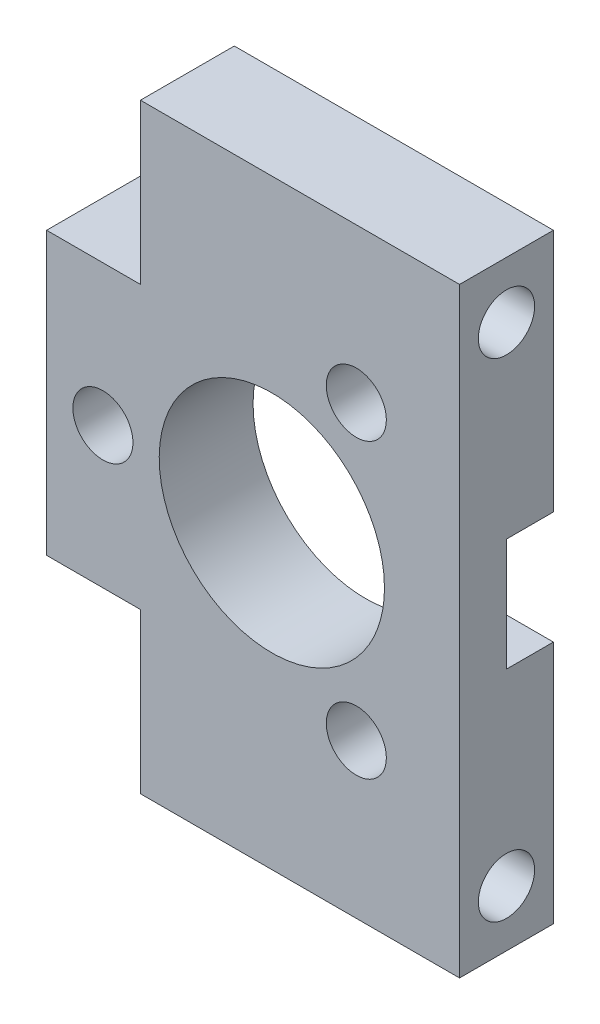
ISO-10303-21;
HEADER;
FILE_DESCRIPTION(('STEP AP214'),'2;1');
FILE_NAME('part.step','',(''),(''),'','','');
FILE_SCHEMA(('AUTOMOTIVE_DESIGN { 1 0 10303 214 1 1 1 1 }'));
ENDSEC;
DATA;
#1=APPLICATION_CONTEXT('core data for automotive mechanical design processes');
#2=APPLICATION_PROTOCOL_DEFINITION('international standard','automotive_design',2000,#1);
#3=PRODUCT_CONTEXT('',#1,'mechanical');
#4=PRODUCT('Part','Part','',(#3));
#5=PRODUCT_RELATED_PRODUCT_CATEGORY('part','',(#4));
#6=PRODUCT_DEFINITION_FORMATION('','',#4);
#7=PRODUCT_DEFINITION_CONTEXT('part definition',#1,'design');
#8=PRODUCT_DEFINITION('design','',#6,#7);
#9=PRODUCT_DEFINITION_SHAPE('','',#8);
#10=(LENGTH_UNIT() NAMED_UNIT(*) SI_UNIT(.MILLI.,.METRE.));
#11=(NAMED_UNIT(*) PLANE_ANGLE_UNIT() SI_UNIT($,.RADIAN.));
#12=(NAMED_UNIT(*) SI_UNIT($,.STERADIAN.) SOLID_ANGLE_UNIT());
#13=UNCERTAINTY_MEASURE_WITH_UNIT(LENGTH_MEASURE(1.E-05),#10,'distance_accuracy_value','');
#14=(GEOMETRIC_REPRESENTATION_CONTEXT(3) GLOBAL_UNCERTAINTY_ASSIGNED_CONTEXT((#13)) GLOBAL_UNIT_ASSIGNED_CONTEXT((#10,
#11,#12)) REPRESENTATION_CONTEXT('',''));
#15=CARTESIAN_POINT('',(0.,0.,0.));
#16=DIRECTION('',(0.,0.,1.));
#17=DIRECTION('',(1.,0.,0.));
#18=AXIS2_PLACEMENT_3D('',#15,#16,#17);
#19=CARTESIAN_POINT('',(-7.,7.5,5.));
#20=DIRECTION('',(0.,0.,-1.));
#21=DIRECTION('',(-1.,0.,0.));
#22=AXIS2_PLACEMENT_3D('',#19,#20,#21);
#23=PLANE('',#22);
#24=CARTESIAN_POINT('',(4.50000000000004,7.79422863405993,5.));
#25=DIRECTION('',(0.,0.,1.));
#26=DIRECTION('',(1.,0.,0.));
#27=AXIS2_PLACEMENT_3D('',#24,#25,#26);
#28=CIRCLE('',#27,1.59999999999937);
#29=CARTESIAN_POINT('',(6.09999999999941,7.79422863405993,5.));
#30=VERTEX_POINT('',#29);
#31=EDGE_CURVE('E232',#30,#30,#28,.T.);
#32=ORIENTED_EDGE('',*,*,#31,.F.);
#33=EDGE_LOOP('',(#32));
#34=FACE_BOUND('',#33,.T.);
#35=CARTESIAN_POINT('',(0.,0.,5.));
#36=DIRECTION('',(0.,0.,1.));
#37=DIRECTION('',(1.,0.,0.));
#38=AXIS2_PLACEMENT_3D('',#35,#36,#37);
#39=CIRCLE('',#38,6.);
#40=CARTESIAN_POINT('',(6.,0.,5.));
#41=VERTEX_POINT('',#40);
#42=EDGE_CURVE('E155',#41,#41,#39,.T.);
#43=ORIENTED_EDGE('',*,*,#42,.F.);
#44=EDGE_LOOP('',(#43));
#45=FACE_BOUND('',#44,.T.);
#46=DIRECTION('',(0.,-1.,0.));
#47=VECTOR('',#46,1.);
#48=CARTESIAN_POINT('',(-7.,16.,5.));
#49=LINE('',#48,#47);
#50=CARTESIAN_POINT('',(-7.,16.,5.));
#51=VERTEX_POINT('',#50);
#52=CARTESIAN_POINT('',(-7.,7.5,5.));
#53=VERTEX_POINT('',#52);
#54=EDGE_CURVE('E168',#51,#53,#49,.T.);
#55=ORIENTED_EDGE('',*,*,#54,.T.);
#56=DIRECTION('',(-1.,0.,0.));
#57=VECTOR('',#56,1.);
#58=CARTESIAN_POINT('',(-7.,7.5,5.));
#59=LINE('',#58,#57);
#60=CARTESIAN_POINT('',(-12.,7.5,5.));
#61=VERTEX_POINT('',#60);
#62=EDGE_CURVE('E106',#53,#61,#59,.T.);
#63=ORIENTED_EDGE('',*,*,#62,.T.);
#64=DIRECTION('',(0.,-1.,0.));
#65=VECTOR('',#64,1.);
#66=CARTESIAN_POINT('',(-12.,7.5,5.));
#67=LINE('',#66,#65);
#68=CARTESIAN_POINT('',(-12.,-7.5,5.));
#69=VERTEX_POINT('',#68);
#70=EDGE_CURVE('E249',#61,#69,#67,.T.);
#71=ORIENTED_EDGE('',*,*,#70,.T.);
#72=DIRECTION('',(1.,0.,0.));
#73=VECTOR('',#72,1.);
#74=CARTESIAN_POINT('',(-12.,-7.5,5.));
#75=LINE('',#74,#73);
#76=CARTESIAN_POINT('',(-7.,-7.5,5.));
#77=VERTEX_POINT('',#76);
#78=EDGE_CURVE('E251',#69,#77,#75,.T.);
#79=ORIENTED_EDGE('',*,*,#78,.T.);
#80=DIRECTION('',(0.,-1.,0.));
#81=VECTOR('',#80,1.);
#82=CARTESIAN_POINT('',(-7.,-7.5,5.));
#83=LINE('',#82,#81);
#84=CARTESIAN_POINT('',(-7.,-16.,5.));
#85=VERTEX_POINT('',#84);
#86=EDGE_CURVE('E128',#77,#85,#83,.T.);
#87=ORIENTED_EDGE('',*,*,#86,.T.);
#88=DIRECTION('',(1.,0.,0.));
#89=VECTOR('',#88,1.);
#90=CARTESIAN_POINT('',(-7.,-16.,5.));
#91=LINE('',#90,#89);
#92=CARTESIAN_POINT('',(9.99999999999999,-16.,5.));
#93=VERTEX_POINT('',#92);
#94=EDGE_CURVE('E121',#85,#93,#91,.T.);
#95=ORIENTED_EDGE('',*,*,#94,.T.);
#96=DIRECTION('',(0.,1.,0.));
#97=VECTOR('',#96,1.);
#98=CARTESIAN_POINT('',(9.99999999999999,16.,5.));
#99=LINE('',#98,#97);
#100=CARTESIAN_POINT('',(9.99999999999999,16.,5.));
#101=VERTEX_POINT('',#100);
#102=EDGE_CURVE('E125',#93,#101,#99,.T.);
#103=ORIENTED_EDGE('',*,*,#102,.T.);
#104=DIRECTION('',(-1.,0.,0.));
#105=VECTOR('',#104,1.);
#106=CARTESIAN_POINT('',(-7.,16.,5.));
#107=LINE('',#106,#105);
#108=EDGE_CURVE('E64',#101,#51,#107,.T.);
#109=ORIENTED_EDGE('',*,*,#108,.T.);
#110=EDGE_LOOP('',(#55,#63,#71,#79,#87,#95,#103,#109));
#111=FACE_BOUND('',#110,.T.);
#112=CARTESIAN_POINT('',(-9.,0.,5.));
#113=DIRECTION('',(0.,0.,1.));
#114=DIRECTION('',(1.,0.,0.));
#115=AXIS2_PLACEMENT_3D('',#112,#113,#114);
#116=CIRCLE('',#115,1.59999999999937);
#117=CARTESIAN_POINT('',(-7.40000000000062,0.,5.));
#118=VERTEX_POINT('',#117);
#119=EDGE_CURVE('E238',#118,#118,#116,.T.);
#120=ORIENTED_EDGE('',*,*,#119,.F.);
#121=EDGE_LOOP('',(#120));
#122=FACE_BOUND('',#121,.T.);
#123=CARTESIAN_POINT('',(4.50000000000004,-7.79422863405993,5.));
#124=DIRECTION('',(0.,0.,1.));
#125=DIRECTION('',(1.,0.,0.));
#126=AXIS2_PLACEMENT_3D('',#123,#124,#125);
#127=CIRCLE('',#126,1.59999999999937);
#128=CARTESIAN_POINT('',(6.09999999999941,-7.79422863405993,5.));
#129=VERTEX_POINT('',#128);
#130=EDGE_CURVE('E226',#129,#129,#127,.T.);
#131=ORIENTED_EDGE('',*,*,#130,.F.);
#132=EDGE_LOOP('',(#131));
#133=FACE_BOUND('',#132,.T.);
#134=ADVANCED_FACE('F40',(#34,#45,#111,#122,#133),#23,.F.);
#135=CARTESIAN_POINT('',(-7.,7.5,0.));
#136=DIRECTION('',(0.,0.,-1.));
#137=DIRECTION('',(-1.,0.,0.));
#138=AXIS2_PLACEMENT_3D('',#135,#136,#137);
#139=PLANE('',#138);
#140=DIRECTION('',(1.,0.,0.));
#141=VECTOR('',#140,1.);
#142=CARTESIAN_POINT('',(10.,3.,0.));
#143=LINE('',#142,#141);
#144=CARTESIAN_POINT('',(5.19615242270664,3.,0.));
#145=VERTEX_POINT('',#144);
#146=CARTESIAN_POINT('',(10.,3.,0.));
#147=VERTEX_POINT('',#146);
#148=EDGE_CURVE('E221',#145,#147,#143,.T.);
#149=ORIENTED_EDGE('',*,*,#148,.F.);
#150=CARTESIAN_POINT('',(0.,0.,0.));
#151=DIRECTION('',(0.,0.,1.));
#152=DIRECTION('',(1.,0.,0.));
#153=AXIS2_PLACEMENT_3D('',#150,#151,#152);
#154=CIRCLE('',#153,6.);
#155=CARTESIAN_POINT('',(5.19615242270663,-3.,0.));
#156=VERTEX_POINT('',#155);
#157=EDGE_CURVE('E241',#145,#156,#154,.T.);
#158=ORIENTED_EDGE('',*,*,#157,.T.);
#159=DIRECTION('',(-1.,0.,0.));
#160=VECTOR('',#159,1.);
#161=CARTESIAN_POINT('',(10.,-3.,0.));
#162=LINE('',#161,#160);
#163=CARTESIAN_POINT('',(10.,-3.,0.));
#164=VERTEX_POINT('',#163);
#165=EDGE_CURVE('E193',#164,#156,#162,.T.);
#166=ORIENTED_EDGE('',*,*,#165,.F.);
#167=DIRECTION('',(0.,1.,0.));
#168=VECTOR('',#167,1.);
#169=CARTESIAN_POINT('',(9.99999999999999,16.,0.));
#170=LINE('',#169,#168);
#171=CARTESIAN_POINT('',(9.99999999999999,-16.,0.));
#172=VERTEX_POINT('',#171);
#173=EDGE_CURVE('E165',#172,#164,#170,.T.);
#174=ORIENTED_EDGE('',*,*,#173,.F.);
#175=DIRECTION('',(1.,0.,0.));
#176=VECTOR('',#175,1.);
#177=CARTESIAN_POINT('',(-7.,-16.,0.));
#178=LINE('',#177,#176);
#179=CARTESIAN_POINT('',(-7.,-16.,0.));
#180=VERTEX_POINT('',#179);
#181=EDGE_CURVE('E137',#180,#172,#178,.T.);
#182=ORIENTED_EDGE('',*,*,#181,.F.);
#183=DIRECTION('',(0.,-1.,0.));
#184=VECTOR('',#183,1.);
#185=CARTESIAN_POINT('',(-7.,-7.5,0.));
#186=LINE('',#185,#184);
#187=CARTESIAN_POINT('',(-7.,-7.5,0.));
#188=VERTEX_POINT('',#187);
#189=EDGE_CURVE('E161',#188,#180,#186,.T.);
#190=ORIENTED_EDGE('',*,*,#189,.F.);
#191=DIRECTION('',(1.,0.,0.));
#192=VECTOR('',#191,1.);
#193=CARTESIAN_POINT('',(-12.,-7.5,0.));
#194=LINE('',#193,#192);
#195=CARTESIAN_POINT('',(-12.,-7.5,0.));
#196=VERTEX_POINT('',#195);
#197=EDGE_CURVE('E159',#196,#188,#194,.T.);
#198=ORIENTED_EDGE('',*,*,#197,.F.);
#199=DIRECTION('',(0.,-1.,0.));
#200=VECTOR('',#199,1.);
#201=CARTESIAN_POINT('',(-12.,7.5,0.));
#202=LINE('',#201,#200);
#203=CARTESIAN_POINT('',(-12.,7.5,0.));
#204=VERTEX_POINT('',#203);
#205=EDGE_CURVE('E157',#204,#196,#202,.T.);
#206=ORIENTED_EDGE('',*,*,#205,.F.);
#207=DIRECTION('',(-1.,0.,0.));
#208=VECTOR('',#207,1.);
#209=CARTESIAN_POINT('',(-7.,7.5,0.));
#210=LINE('',#209,#208);
#211=CARTESIAN_POINT('',(-7.,7.5,0.));
#212=VERTEX_POINT('',#211);
#213=EDGE_CURVE('E154',#212,#204,#210,.T.);
#214=ORIENTED_EDGE('',*,*,#213,.F.);
#215=DIRECTION('',(0.,-1.,0.));
#216=VECTOR('',#215,1.);
#217=CARTESIAN_POINT('',(-7.,16.,0.));
#218=LINE('',#217,#216);
#219=CARTESIAN_POINT('',(-7.,16.,0.));
#220=VERTEX_POINT('',#219);
#221=EDGE_CURVE('E151',#220,#212,#218,.T.);
#222=ORIENTED_EDGE('',*,*,#221,.F.);
#223=DIRECTION('',(-1.,0.,0.));
#224=VECTOR('',#223,1.);
#225=CARTESIAN_POINT('',(-7.,16.,0.));
#226=LINE('',#225,#224);
#227=CARTESIAN_POINT('',(9.99999999999999,16.,0.));
#228=VERTEX_POINT('',#227);
#229=EDGE_CURVE('E97',#228,#220,#226,.T.);
#230=ORIENTED_EDGE('',*,*,#229,.F.);
#231=EDGE_CURVE('E164',#147,#228,#170,.T.);
#232=ORIENTED_EDGE('',*,*,#231,.F.);
#233=EDGE_LOOP('',(#149,#158,#166,#174,#182,#190,#198,#206,#214,#222,#230,#232));
#234=FACE_BOUND('',#233,.T.);
#235=CARTESIAN_POINT('',(4.50000000000004,7.79422863405993,0.));
#236=DIRECTION('',(0.,0.,1.));
#237=DIRECTION('',(1.,0.,0.));
#238=AXIS2_PLACEMENT_3D('',#235,#236,#237);
#239=CIRCLE('',#238,1.59999999999937);
#240=CARTESIAN_POINT('',(6.09999999999941,7.79422863405993,0.));
#241=VERTEX_POINT('',#240);
#242=EDGE_CURVE('E229',#241,#241,#239,.T.);
#243=ORIENTED_EDGE('',*,*,#242,.T.);
#244=EDGE_LOOP('',(#243));
#245=FACE_BOUND('',#244,.T.);
#246=CARTESIAN_POINT('',(-9.,0.,0.));
#247=DIRECTION('',(0.,0.,1.));
#248=DIRECTION('',(1.,0.,0.));
#249=AXIS2_PLACEMENT_3D('',#246,#247,#248);
#250=CIRCLE('',#249,1.59999999999937);
#251=CARTESIAN_POINT('',(-7.40000000000062,0.,0.));
#252=VERTEX_POINT('',#251);
#253=EDGE_CURVE('E235',#252,#252,#250,.T.);
#254=ORIENTED_EDGE('',*,*,#253,.T.);
#255=EDGE_LOOP('',(#254));
#256=FACE_BOUND('',#255,.T.);
#257=CARTESIAN_POINT('',(4.50000000000004,-7.79422863405993,0.));
#258=DIRECTION('',(0.,0.,1.));
#259=DIRECTION('',(1.,0.,0.));
#260=AXIS2_PLACEMENT_3D('',#257,#258,#259);
#261=CIRCLE('',#260,1.59999999999937);
#262=CARTESIAN_POINT('',(6.09999999999941,-7.79422863405993,0.));
#263=VERTEX_POINT('',#262);
#264=EDGE_CURVE('E224',#263,#263,#261,.T.);
#265=ORIENTED_EDGE('',*,*,#264,.T.);
#266=EDGE_LOOP('',(#265));
#267=FACE_BOUND('',#266,.T.);
#268=ADVANCED_FACE('F263',(#234,#245,#256,#267),#139,.T.);
#269=CARTESIAN_POINT('',(-7.,16.,5.));
#270=DIRECTION('',(1.,0.,0.));
#271=DIRECTION('',(0.,0.,-1.));
#272=AXIS2_PLACEMENT_3D('',#269,#270,#271);
#273=PLANE('',#272);
#274=CARTESIAN_POINT('',(-7.,13.,2.5));
#275=DIRECTION('',(1.,0.,0.));
#276=DIRECTION('',(0.,0.,-1.));
#277=AXIS2_PLACEMENT_3D('',#274,#275,#276);
#278=CIRCLE('',#277,1.5);
#279=CARTESIAN_POINT('',(-7.,13.,1.));
#280=VERTEX_POINT('',#279);
#281=EDGE_CURVE('E222',#280,#280,#278,.T.);
#282=ORIENTED_EDGE('',*,*,#281,.T.);
#283=EDGE_LOOP('',(#282));
#284=FACE_BOUND('',#283,.T.);
#285=ORIENTED_EDGE('',*,*,#221,.T.);
#286=DIRECTION('',(0.,0.,-1.));
#287=VECTOR('',#286,1.);
#288=CARTESIAN_POINT('',(-7.,7.5,5.));
#289=LINE('',#288,#287);
#290=EDGE_CURVE('E181',#53,#212,#289,.T.);
#291=ORIENTED_EDGE('',*,*,#290,.F.);
#292=ORIENTED_EDGE('',*,*,#54,.F.);
#293=DIRECTION('',(0.,0.,-1.));
#294=VECTOR('',#293,1.);
#295=CARTESIAN_POINT('',(-7.,16.,5.));
#296=LINE('',#295,#294);
#297=EDGE_CURVE('E147',#51,#220,#296,.T.);
#298=ORIENTED_EDGE('',*,*,#297,.T.);
#299=EDGE_LOOP('',(#285,#291,#292,#298));
#300=FACE_BOUND('',#299,.T.);
#301=ADVANCED_FACE('F42',(#284,#300),#273,.F.);
#302=CARTESIAN_POINT('',(-7.,7.5,5.));
#303=DIRECTION('',(0.,-1.,0.));
#304=DIRECTION('',(1.,0.,0.));
#305=AXIS2_PLACEMENT_3D('',#302,#303,#304);
#306=PLANE('',#305);
#307=ORIENTED_EDGE('',*,*,#213,.T.);
#308=DIRECTION('',(0.,0.,-1.));
#309=VECTOR('',#308,1.);
#310=CARTESIAN_POINT('',(-12.,7.5,5.));
#311=LINE('',#310,#309);
#312=EDGE_CURVE('E178',#61,#204,#311,.T.);
#313=ORIENTED_EDGE('',*,*,#312,.F.);
#314=ORIENTED_EDGE('',*,*,#62,.F.);
#315=ORIENTED_EDGE('',*,*,#290,.T.);
#316=EDGE_LOOP('',(#307,#313,#314,#315));
#317=FACE_BOUND('',#316,.T.);
#318=ADVANCED_FACE('F345',(#317),#306,.F.);
#319=CARTESIAN_POINT('',(-12.,7.5,5.));
#320=DIRECTION('',(1.,0.,0.));
#321=DIRECTION('',(0.,0.,-1.));
#322=AXIS2_PLACEMENT_3D('',#319,#320,#321);
#323=PLANE('',#322);
#324=ORIENTED_EDGE('',*,*,#205,.T.);
#325=DIRECTION('',(0.,0.,-1.));
#326=VECTOR('',#325,1.);
#327=CARTESIAN_POINT('',(-12.,-7.5,5.));
#328=LINE('',#327,#326);
#329=EDGE_CURVE('E175',#69,#196,#328,.T.);
#330=ORIENTED_EDGE('',*,*,#329,.F.);
#331=ORIENTED_EDGE('',*,*,#70,.F.);
#332=ORIENTED_EDGE('',*,*,#312,.T.);
#333=EDGE_LOOP('',(#324,#330,#331,#332));
#334=FACE_BOUND('',#333,.T.);
#335=ADVANCED_FACE('F349',(#334),#323,.F.);
#336=CARTESIAN_POINT('',(-12.,-7.5,5.));
#337=DIRECTION('',(0.,1.,0.));
#338=DIRECTION('',(-1.,0.,0.));
#339=AXIS2_PLACEMENT_3D('',#336,#337,#338);
#340=PLANE('',#339);
#341=ORIENTED_EDGE('',*,*,#197,.T.);
#342=DIRECTION('',(0.,0.,-1.));
#343=VECTOR('',#342,1.);
#344=CARTESIAN_POINT('',(-7.,-7.5,5.));
#345=LINE('',#344,#343);
#346=EDGE_CURVE('E172',#77,#188,#345,.T.);
#347=ORIENTED_EDGE('',*,*,#346,.F.);
#348=ORIENTED_EDGE('',*,*,#78,.F.);
#349=ORIENTED_EDGE('',*,*,#329,.T.);
#350=EDGE_LOOP('',(#341,#347,#348,#349));
#351=FACE_BOUND('',#350,.T.);
#352=ADVANCED_FACE('F257',(#351),#340,.F.);
#353=CARTESIAN_POINT('',(-7.,-7.5,5.));
#354=DIRECTION('',(1.,0.,0.));
#355=DIRECTION('',(0.,0.,-1.));
#356=AXIS2_PLACEMENT_3D('',#353,#354,#355);
#357=PLANE('',#356);
#358=CARTESIAN_POINT('',(-7.,-13.,2.5));
#359=DIRECTION('',(1.,0.,0.));
#360=DIRECTION('',(0.,0.,-1.));
#361=AXIS2_PLACEMENT_3D('',#358,#359,#360);
#362=CIRCLE('',#361,1.5);
#363=CARTESIAN_POINT('',(-7.,-13.,1.));
#364=VERTEX_POINT('',#363);
#365=EDGE_CURVE('E332',#364,#364,#362,.T.);
#366=ORIENTED_EDGE('',*,*,#365,.T.);
#367=EDGE_LOOP('',(#366));
#368=FACE_BOUND('',#367,.T.);
#369=ORIENTED_EDGE('',*,*,#189,.T.);
#370=DIRECTION('',(0.,0.,-1.));
#371=VECTOR('',#370,1.);
#372=CARTESIAN_POINT('',(-7.,-16.,5.));
#373=LINE('',#372,#371);
#374=EDGE_CURVE('E141',#85,#180,#373,.T.);
#375=ORIENTED_EDGE('',*,*,#374,.F.);
#376=ORIENTED_EDGE('',*,*,#86,.F.);
#377=ORIENTED_EDGE('',*,*,#346,.T.);
#378=EDGE_LOOP('',(#369,#375,#376,#377));
#379=FACE_BOUND('',#378,.T.);
#380=ADVANCED_FACE('F261',(#368,#379),#357,.F.);
#381=CARTESIAN_POINT('',(-7.,-16.,5.));
#382=DIRECTION('',(0.,1.,0.));
#383=DIRECTION('',(0.,0.,1.));
#384=AXIS2_PLACEMENT_3D('',#381,#382,#383);
#385=PLANE('',#384);
#386=ORIENTED_EDGE('',*,*,#181,.T.);
#387=DIRECTION('',(0.,0.,-1.));
#388=VECTOR('',#387,1.);
#389=CARTESIAN_POINT('',(9.99999999999999,-16.,5.));
#390=LINE('',#389,#388);
#391=EDGE_CURVE('E134',#93,#172,#390,.T.);
#392=ORIENTED_EDGE('',*,*,#391,.F.);
#393=ORIENTED_EDGE('',*,*,#94,.F.);
#394=ORIENTED_EDGE('',*,*,#374,.T.);
#395=EDGE_LOOP('',(#386,#392,#393,#394));
#396=FACE_BOUND('',#395,.T.);
#397=ADVANCED_FACE('F135',(#396),#385,.F.);
#398=CARTESIAN_POINT('',(9.99999999999999,16.,5.));
#399=DIRECTION('',(-1.,0.,0.));
#400=DIRECTION('',(0.,0.,1.));
#401=AXIS2_PLACEMENT_3D('',#398,#399,#400);
#402=PLANE('',#401);
#403=CARTESIAN_POINT('',(10.,-13.,2.5));
#404=DIRECTION('',(-1.,0.,0.));
#405=DIRECTION('',(0.,0.,1.));
#406=AXIS2_PLACEMENT_3D('',#403,#404,#405);
#407=CIRCLE('',#406,1.5);
#408=CARTESIAN_POINT('',(10.,-13.,4.));
#409=VERTEX_POINT('',#408);
#410=EDGE_CURVE('E329',#409,#409,#407,.T.);
#411=ORIENTED_EDGE('',*,*,#410,.T.);
#412=EDGE_LOOP('',(#411));
#413=FACE_BOUND('',#412,.T.);
#414=CARTESIAN_POINT('',(10.,13.,2.5));
#415=DIRECTION('',(-1.,0.,0.));
#416=DIRECTION('',(0.,0.,1.));
#417=AXIS2_PLACEMENT_3D('',#414,#415,#416);
#418=CIRCLE('',#417,1.5);
#419=CARTESIAN_POINT('',(10.,13.,4.));
#420=VERTEX_POINT('',#419);
#421=EDGE_CURVE('E334',#420,#420,#418,.T.);
#422=ORIENTED_EDGE('',*,*,#421,.T.);
#423=EDGE_LOOP('',(#422));
#424=FACE_BOUND('',#423,.T.);
#425=DIRECTION('',(0.,-1.,0.));
#426=VECTOR('',#425,1.);
#427=CARTESIAN_POINT('',(10.,3.,2.5));
#428=LINE('',#427,#426);
#429=CARTESIAN_POINT('',(10.,3.,2.5));
#430=VERTEX_POINT('',#429);
#431=CARTESIAN_POINT('',(10.,-3.,2.5));
#432=VERTEX_POINT('',#431);
#433=EDGE_CURVE('E216',#430,#432,#428,.T.);
#434=ORIENTED_EDGE('',*,*,#433,.F.);
#435=DIRECTION('',(0.,0.,-1.));
#436=VECTOR('',#435,1.);
#437=CARTESIAN_POINT('',(10.,3.,2.5));
#438=LINE('',#437,#436);
#439=EDGE_CURVE('E212',#430,#147,#438,.T.);
#440=ORIENTED_EDGE('',*,*,#439,.T.);
#441=ORIENTED_EDGE('',*,*,#231,.T.);
#442=DIRECTION('',(0.,0.,-1.));
#443=VECTOR('',#442,1.);
#444=CARTESIAN_POINT('',(9.99999999999999,16.,5.));
#445=LINE('',#444,#443);
#446=EDGE_CURVE('E142',#101,#228,#445,.T.);
#447=ORIENTED_EDGE('',*,*,#446,.F.);
#448=ORIENTED_EDGE('',*,*,#102,.F.);
#449=ORIENTED_EDGE('',*,*,#391,.T.);
#450=ORIENTED_EDGE('',*,*,#173,.T.);
#451=DIRECTION('',(0.,0.,-1.));
#452=VECTOR('',#451,1.);
#453=CARTESIAN_POINT('',(10.,-3.,2.5));
#454=LINE('',#453,#452);
#455=EDGE_CURVE('E213',#432,#164,#454,.T.);
#456=ORIENTED_EDGE('',*,*,#455,.F.);
#457=EDGE_LOOP('',(#434,#440,#441,#447,#448,#449,#450,#456));
#458=FACE_BOUND('',#457,.T.);
#459=ADVANCED_FACE('F145',(#413,#424,#458),#402,.F.);
#460=CARTESIAN_POINT('',(-7.,16.,5.));
#461=DIRECTION('',(0.,-1.,0.));
#462=DIRECTION('',(0.,0.,-1.));
#463=AXIS2_PLACEMENT_3D('',#460,#461,#462);
#464=PLANE('',#463);
#465=ORIENTED_EDGE('',*,*,#229,.T.);
#466=ORIENTED_EDGE('',*,*,#297,.F.);
#467=ORIENTED_EDGE('',*,*,#108,.F.);
#468=ORIENTED_EDGE('',*,*,#446,.T.);
#469=EDGE_LOOP('',(#465,#466,#467,#468));
#470=FACE_BOUND('',#469,.T.);
#471=ADVANCED_FACE('F279',(#470),#464,.F.);
#472=CARTESIAN_POINT('',(0.,0.,5.));
#473=DIRECTION('',(0.,0.,-1.));
#474=DIRECTION('',(-1.,0.,0.));
#475=AXIS2_PLACEMENT_3D('',#472,#473,#474);
#476=CYLINDRICAL_SURFACE('',#475,6.);
#477=DIRECTION('',(0.,0.,-1.));
#478=VECTOR('',#477,1.);
#479=CARTESIAN_POINT('',(5.19615242270664,3.,5.));
#480=LINE('',#479,#478);
#481=CARTESIAN_POINT('',(5.19615242270664,3.,2.5));
#482=VERTEX_POINT('',#481);
#483=EDGE_CURVE('E12',#482,#145,#480,.T.);
#484=ORIENTED_EDGE('',*,*,#483,.F.);
#485=CARTESIAN_POINT('',(0.,0.,2.5));
#486=DIRECTION('',(0.,0.,-1.));
#487=DIRECTION('',(-1.,0.,0.));
#488=AXIS2_PLACEMENT_3D('',#485,#486,#487);
#489=CIRCLE('',#488,6.);
#490=CARTESIAN_POINT('',(5.19615242270663,-3.,2.5));
#491=VERTEX_POINT('',#490);
#492=EDGE_CURVE('E183',#482,#491,#489,.T.);
#493=ORIENTED_EDGE('',*,*,#492,.T.);
#494=DIRECTION('',(0.,0.,-1.));
#495=VECTOR('',#494,1.);
#496=CARTESIAN_POINT('',(5.19615242270663,-3.,5.));
#497=LINE('',#496,#495);
#498=EDGE_CURVE('E48',#156,#491,#497,.F.);
#499=ORIENTED_EDGE('',*,*,#498,.F.);
#500=ORIENTED_EDGE('',*,*,#157,.F.);
#501=EDGE_LOOP('',(#484,#493,#499,#500));
#502=FACE_BOUND('',#501,.T.);
#503=ORIENTED_EDGE('',*,*,#42,.T.);
#504=EDGE_LOOP('',(#503));
#505=FACE_BOUND('',#504,.T.);
#506=ADVANCED_FACE('F198',(#502,#505),#476,.F.);
#507=CARTESIAN_POINT('',(-9.,0.,5.));
#508=DIRECTION('',(0.,0.,-1.));
#509=DIRECTION('',(-1.,0.,0.));
#510=AXIS2_PLACEMENT_3D('',#507,#508,#509);
#511=CYLINDRICAL_SURFACE('',#510,1.59999999999937);
#512=ORIENTED_EDGE('',*,*,#119,.T.);
#513=EDGE_LOOP('',(#512));
#514=FACE_BOUND('',#513,.T.);
#515=ORIENTED_EDGE('',*,*,#253,.F.);
#516=EDGE_LOOP('',(#515));
#517=FACE_BOUND('',#516,.T.);
#518=ADVANCED_FACE('F286',(#514,#517),#511,.F.);
#519=CARTESIAN_POINT('',(4.50000000000004,7.79422863405993,5.));
#520=DIRECTION('',(0.,0.,-1.));
#521=DIRECTION('',(-1.,0.,0.));
#522=AXIS2_PLACEMENT_3D('',#519,#520,#521);
#523=CYLINDRICAL_SURFACE('',#522,1.59999999999937);
#524=ORIENTED_EDGE('',*,*,#31,.T.);
#525=EDGE_LOOP('',(#524));
#526=FACE_BOUND('',#525,.T.);
#527=ORIENTED_EDGE('',*,*,#242,.F.);
#528=EDGE_LOOP('',(#527));
#529=FACE_BOUND('',#528,.T.);
#530=ADVANCED_FACE('F302',(#526,#529),#523,.F.);
#531=CARTESIAN_POINT('',(4.50000000000004,-7.79422863405993,5.));
#532=DIRECTION('',(0.,0.,-1.));
#533=DIRECTION('',(-1.,0.,0.));
#534=AXIS2_PLACEMENT_3D('',#531,#532,#533);
#535=CYLINDRICAL_SURFACE('',#534,1.59999999999937);
#536=ORIENTED_EDGE('',*,*,#130,.T.);
#537=EDGE_LOOP('',(#536));
#538=FACE_BOUND('',#537,.T.);
#539=ORIENTED_EDGE('',*,*,#264,.F.);
#540=EDGE_LOOP('',(#539));
#541=FACE_BOUND('',#540,.T.);
#542=ADVANCED_FACE('F306',(#538,#541),#535,.F.);
#543=CARTESIAN_POINT('',(10.,3.,2.5));
#544=DIRECTION('',(0.,1.,0.));
#545=DIRECTION('',(-1.,0.,0.));
#546=AXIS2_PLACEMENT_3D('',#543,#544,#545);
#547=PLANE('',#546);
#548=ORIENTED_EDGE('',*,*,#483,.T.);
#549=ORIENTED_EDGE('',*,*,#148,.T.);
#550=ORIENTED_EDGE('',*,*,#439,.F.);
#551=DIRECTION('',(1.,0.,0.));
#552=VECTOR('',#551,1.);
#553=CARTESIAN_POINT('',(10.,3.,2.5));
#554=LINE('',#553,#552);
#555=EDGE_CURVE('E204',#482,#430,#554,.T.);
#556=ORIENTED_EDGE('',*,*,#555,.F.);
#557=EDGE_LOOP('',(#548,#549,#550,#556));
#558=FACE_BOUND('',#557,.T.);
#559=ADVANCED_FACE('F208',(#558),#547,.F.);
#560=CARTESIAN_POINT('',(10.,-3.,2.5));
#561=DIRECTION('',(0.,-1.,0.));
#562=DIRECTION('',(1.,0.,0.));
#563=AXIS2_PLACEMENT_3D('',#560,#561,#562);
#564=PLANE('',#563);
#565=ORIENTED_EDGE('',*,*,#498,.T.);
#566=DIRECTION('',(-1.,0.,0.));
#567=VECTOR('',#566,1.);
#568=CARTESIAN_POINT('',(10.,-3.,2.5));
#569=LINE('',#568,#567);
#570=EDGE_CURVE('E55',#432,#491,#569,.T.);
#571=ORIENTED_EDGE('',*,*,#570,.F.);
#572=ORIENTED_EDGE('',*,*,#455,.T.);
#573=ORIENTED_EDGE('',*,*,#165,.T.);
#574=EDGE_LOOP('',(#565,#571,#572,#573));
#575=FACE_BOUND('',#574,.T.);
#576=ADVANCED_FACE('F188',(#575),#564,.F.);
#577=CARTESIAN_POINT('',(10.,-3.,2.5));
#578=DIRECTION('',(0.,0.,-1.));
#579=DIRECTION('',(-1.,0.,0.));
#580=AXIS2_PLACEMENT_3D('',#577,#578,#579);
#581=PLANE('',#580);
#582=ORIENTED_EDGE('',*,*,#555,.T.);
#583=ORIENTED_EDGE('',*,*,#433,.T.);
#584=ORIENTED_EDGE('',*,*,#570,.T.);
#585=ORIENTED_EDGE('',*,*,#492,.F.);
#586=EDGE_LOOP('',(#582,#583,#584,#585));
#587=FACE_BOUND('',#586,.T.);
#588=ADVANCED_FACE('F202',(#587),#581,.T.);
#589=CARTESIAN_POINT('',(10.,13.,2.5));
#590=DIRECTION('',(-1.,0.,0.));
#591=DIRECTION('',(0.,0.,1.));
#592=AXIS2_PLACEMENT_3D('',#589,#590,#591);
#593=CYLINDRICAL_SURFACE('',#592,1.5);
#594=ORIENTED_EDGE('',*,*,#421,.F.);
#595=EDGE_LOOP('',(#594));
#596=FACE_BOUND('',#595,.T.);
#597=ORIENTED_EDGE('',*,*,#281,.F.);
#598=EDGE_LOOP('',(#597));
#599=FACE_BOUND('',#598,.T.);
#600=ADVANCED_FACE('F317',(#596,#599),#593,.F.);
#601=CARTESIAN_POINT('',(10.,-13.,2.5));
#602=DIRECTION('',(-1.,0.,0.));
#603=DIRECTION('',(0.,0.,1.));
#604=AXIS2_PLACEMENT_3D('',#601,#602,#603);
#605=CYLINDRICAL_SURFACE('',#604,1.5);
#606=ORIENTED_EDGE('',*,*,#410,.F.);
#607=EDGE_LOOP('',(#606));
#608=FACE_BOUND('',#607,.T.);
#609=ORIENTED_EDGE('',*,*,#365,.F.);
#610=EDGE_LOOP('',(#609));
#611=FACE_BOUND('',#610,.T.);
#612=ADVANCED_FACE('F320',(#608,#611),#605,.F.);
#613=CLOSED_SHELL('',(#134,#268,#301,#318,#335,#352,#380,#397,#459,#471,#506,#518,#530,#542,
#559,#576,#588,#600,#612));
#614=MANIFOLD_SOLID_BREP('B2',#613);
#615=ADVANCED_BREP_SHAPE_REPRESENTATION('',(#18,#614),#14);
#616=SHAPE_DEFINITION_REPRESENTATION(#9,#615);
ENDSEC;
END-ISO-10303-21;
